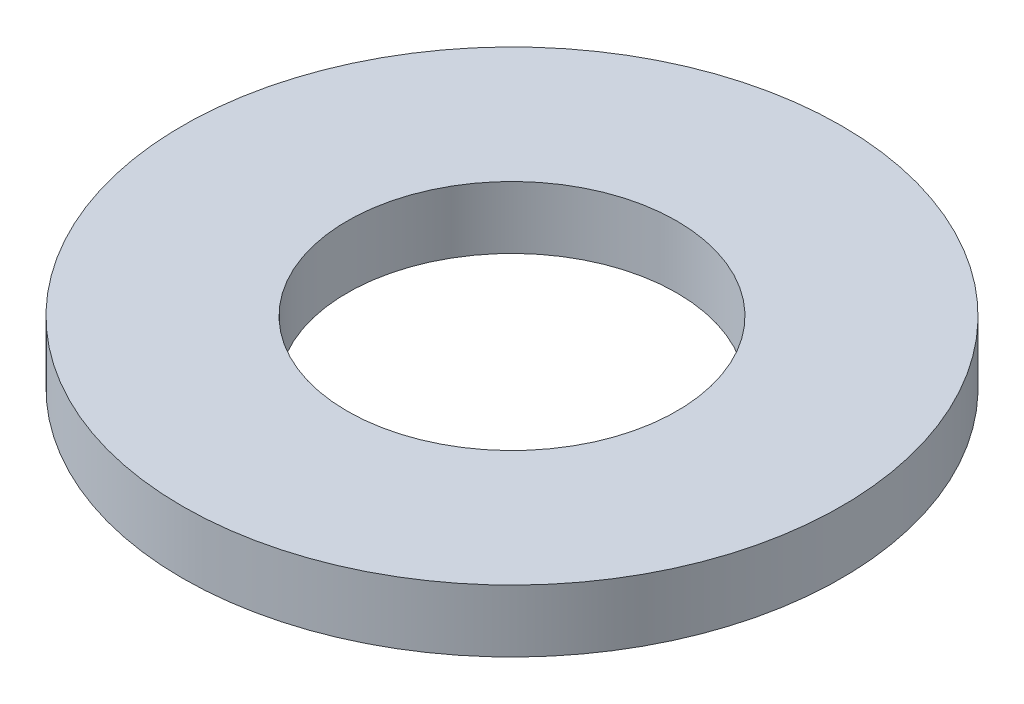
ISO-10303-21;
HEADER;
FILE_DESCRIPTION(('STEP AP214'),'2;1');
FILE_NAME('part.step','',(''),(''),'','','');
FILE_SCHEMA(('AUTOMOTIVE_DESIGN { 1 0 10303 214 1 1 1 1 }'));
ENDSEC;
DATA;
#1=APPLICATION_CONTEXT('core data for automotive mechanical design processes');
#2=APPLICATION_PROTOCOL_DEFINITION('international standard','automotive_design',2000,#1);
#3=PRODUCT_CONTEXT('',#1,'mechanical');
#4=PRODUCT('Part','Part','',(#3));
#5=PRODUCT_RELATED_PRODUCT_CATEGORY('part','',(#4));
#6=PRODUCT_DEFINITION_FORMATION('','',#4);
#7=PRODUCT_DEFINITION_CONTEXT('part definition',#1,'design');
#8=PRODUCT_DEFINITION('design','',#6,#7);
#9=PRODUCT_DEFINITION_SHAPE('','',#8);
#10=(LENGTH_UNIT() NAMED_UNIT(*) SI_UNIT(.MILLI.,.METRE.));
#11=(NAMED_UNIT(*) PLANE_ANGLE_UNIT() SI_UNIT($,.RADIAN.));
#12=(NAMED_UNIT(*) SI_UNIT($,.STERADIAN.) SOLID_ANGLE_UNIT());
#13=UNCERTAINTY_MEASURE_WITH_UNIT(LENGTH_MEASURE(1.E-05),#10,'distance_accuracy_value','');
#14=(GEOMETRIC_REPRESENTATION_CONTEXT(3) GLOBAL_UNCERTAINTY_ASSIGNED_CONTEXT((#13)) GLOBAL_UNIT_ASSIGNED_CONTEXT((#10,
#11,#12)) REPRESENTATION_CONTEXT('',''));
#15=CARTESIAN_POINT('',(0.,0.,0.));
#16=DIRECTION('',(0.,0.,1.));
#17=DIRECTION('',(1.,0.,0.));
#18=AXIS2_PLACEMENT_3D('',#15,#16,#17);
#19=CARTESIAN_POINT('',(-47.1142864227295,1.651,-64.5517635345459));
#20=DIRECTION('',(0.,-1.,0.));
#21=DIRECTION('',(0.,0.,-1.));
#22=AXIS2_PLACEMENT_3D('',#19,#20,#21);
#23=CYLINDRICAL_SURFACE('',#22,8.73125);
#24=CARTESIAN_POINT('',(-47.1142864227295,1.651,-64.5517635345459));
#25=DIRECTION('',(0.,-1.,0.));
#26=DIRECTION('',(0.,0.,1.));
#27=AXIS2_PLACEMENT_3D('',#24,#25,#26);
#28=CIRCLE('',#27,8.73125);
#29=CARTESIAN_POINT('',(-47.1142864227295,1.651,-73.2830135345459));
#30=VERTEX_POINT('',#29);
#31=EDGE_CURVE('E10',#30,#30,#28,.T.);
#32=CARTESIAN_POINT('',(-47.1142864227295,0.,-64.5517635345459));
#33=DIRECTION('',(0.,-1.,0.));
#34=DIRECTION('',(0.,0.,1.));
#35=AXIS2_PLACEMENT_3D('',#32,#33,#34);
#36=CIRCLE('',#35,8.73125);
#37=CARTESIAN_POINT('',(-47.1142864227295,0.,-73.2830135345459));
#38=VERTEX_POINT('',#37);
#39=EDGE_CURVE('E33',#38,#38,#36,.T.);
#40=CARTESIAN_POINT('',(-47.1142864227295,1.651,-73.2830135345459));
#41=CARTESIAN_POINT('',(-47.1142864227295,1.63380208333333,-73.2830135345459));
#42=CARTESIAN_POINT('',(-47.1142864227295,1.61660416666667,-73.2830135345459));
#43=CARTESIAN_POINT('',(-47.1142864227295,1.58220833333333,-73.2830135345459));
#44=CARTESIAN_POINT('',(-47.1142864227295,1.56501041666667,-73.2830135345459));
#45=CARTESIAN_POINT('',(-47.1142864227295,1.53061458333333,-73.2830135345459));
#46=CARTESIAN_POINT('',(-47.1142864227295,1.51341666666667,-73.2830135345459));
#47=CARTESIAN_POINT('',(-47.1142864227295,1.47902083333333,-73.2830135345459));
#48=CARTESIAN_POINT('',(-47.1142864227295,1.46182291666667,-73.2830135345459));
#49=CARTESIAN_POINT('',(-47.1142864227295,1.42742708333333,-73.2830135345459));
#50=CARTESIAN_POINT('',(-47.1142864227295,1.41022916666667,-73.2830135345459));
#51=CARTESIAN_POINT('',(-47.1142864227295,1.37583333333333,-73.2830135345459));
#52=CARTESIAN_POINT('',(-47.1142864227295,1.35863541666667,-73.2830135345459));
#53=CARTESIAN_POINT('',(-47.1142864227295,1.32423958333333,-73.2830135345459));
#54=CARTESIAN_POINT('',(-47.1142864227295,1.30704166666667,-73.2830135345459));
#55=CARTESIAN_POINT('',(-47.1142864227295,1.27264583333333,-73.2830135345459));
#56=CARTESIAN_POINT('',(-47.1142864227295,1.25544791666667,-73.2830135345459));
#57=CARTESIAN_POINT('',(-47.1142864227295,1.22105208333333,-73.2830135345459));
#58=CARTESIAN_POINT('',(-47.1142864227295,1.20385416666667,-73.2830135345459));
#59=CARTESIAN_POINT('',(-47.1142864227295,1.16945833333333,-73.2830135345459));
#60=CARTESIAN_POINT('',(-47.1142864227295,1.15226041666667,-73.2830135345459));
#61=CARTESIAN_POINT('',(-47.1142864227295,1.11786458333333,-73.2830135345459));
#62=CARTESIAN_POINT('',(-47.1142864227295,1.10066666666667,-73.2830135345459));
#63=CARTESIAN_POINT('',(-47.1142864227295,1.06627083333333,-73.2830135345459));
#64=CARTESIAN_POINT('',(-47.1142864227295,1.04907291666667,-73.2830135345459));
#65=CARTESIAN_POINT('',(-47.1142864227295,1.01467708333333,-73.2830135345459));
#66=CARTESIAN_POINT('',(-47.1142864227295,0.997479166666667,-73.2830135345459));
#67=CARTESIAN_POINT('',(-47.1142864227295,0.963083333333333,-73.2830135345459));
#68=CARTESIAN_POINT('',(-47.1142864227295,0.945885416666667,-73.2830135345459));
#69=CARTESIAN_POINT('',(-47.1142864227295,0.911489583333333,-73.2830135345459));
#70=CARTESIAN_POINT('',(-47.1142864227295,0.894291666666667,-73.2830135345459));
#71=CARTESIAN_POINT('',(-47.1142864227295,0.859895833333333,-73.2830135345459));
#72=CARTESIAN_POINT('',(-47.1142864227295,0.842697916666667,-73.2830135345459));
#73=CARTESIAN_POINT('',(-47.1142864227295,0.808302083333333,-73.2830135345459));
#74=CARTESIAN_POINT('',(-47.1142864227295,0.791104166666667,-73.2830135345459));
#75=CARTESIAN_POINT('',(-47.1142864227295,0.756708333333333,-73.2830135345459));
#76=CARTESIAN_POINT('',(-47.1142864227295,0.739510416666667,-73.2830135345459));
#77=CARTESIAN_POINT('',(-47.1142864227295,0.705114583333333,-73.2830135345459));
#78=CARTESIAN_POINT('',(-47.1142864227295,0.687916666666667,-73.2830135345459));
#79=CARTESIAN_POINT('',(-47.1142864227295,0.653520833333333,-73.2830135345459));
#80=CARTESIAN_POINT('',(-47.1142864227295,0.636322916666667,-73.2830135345459));
#81=CARTESIAN_POINT('',(-47.1142864227295,0.601927083333333,-73.2830135345459));
#82=CARTESIAN_POINT('',(-47.1142864227295,0.584729166666667,-73.2830135345459));
#83=CARTESIAN_POINT('',(-47.1142864227295,0.550333333333333,-73.2830135345459));
#84=CARTESIAN_POINT('',(-47.1142864227295,0.533135416666667,-73.2830135345459));
#85=CARTESIAN_POINT('',(-47.1142864227295,0.498739583333333,-73.2830135345459));
#86=CARTESIAN_POINT('',(-47.1142864227295,0.481541666666667,-73.2830135345459));
#87=CARTESIAN_POINT('',(-47.1142864227295,0.447145833333333,-73.2830135345459));
#88=CARTESIAN_POINT('',(-47.1142864227295,0.429947916666667,-73.2830135345459));
#89=CARTESIAN_POINT('',(-47.1142864227295,0.395552083333333,-73.2830135345459));
#90=CARTESIAN_POINT('',(-47.1142864227295,0.378354166666667,-73.2830135345459));
#91=CARTESIAN_POINT('',(-47.1142864227295,0.343958333333333,-73.2830135345459));
#92=CARTESIAN_POINT('',(-47.1142864227295,0.326760416666667,-73.2830135345459));
#93=CARTESIAN_POINT('',(-47.1142864227295,0.292364583333333,-73.2830135345459));
#94=CARTESIAN_POINT('',(-47.1142864227295,0.275166666666667,-73.2830135345459));
#95=CARTESIAN_POINT('',(-47.1142864227295,0.240770833333333,-73.2830135345459));
#96=CARTESIAN_POINT('',(-47.1142864227295,0.223572916666667,-73.2830135345459));
#97=CARTESIAN_POINT('',(-47.1142864227295,0.189177083333333,-73.2830135345459));
#98=CARTESIAN_POINT('',(-47.1142864227295,0.171979166666667,-73.2830135345459));
#99=CARTESIAN_POINT('',(-47.1142864227295,0.137583333333333,-73.2830135345459));
#100=CARTESIAN_POINT('',(-47.1142864227295,0.120385416666667,-73.2830135345459));
#101=CARTESIAN_POINT('',(-47.1142864227295,0.0859895833333333,-73.2830135345459));
#102=CARTESIAN_POINT('',(-47.1142864227295,0.0687916666666667,-73.2830135345459));
#103=CARTESIAN_POINT('',(-47.1142864227295,0.0343958333333333,-73.2830135345459));
#104=CARTESIAN_POINT('',(-47.1142864227295,0.0171979166666666,-73.2830135345459));
#105=CARTESIAN_POINT('',(-47.1142864227295,0.,-73.2830135345459));
#106=B_SPLINE_CURVE_WITH_KNOTS('',3,(#40,#41,#42,#43,#44,#45,#46,#47,#48,#49,#50,#51,#52,#53,
#54,#55,#56,#57,#58,#59,#60,#61,#62,#63,#64,#65,#66,#67,#68,#69,#70,#71,#72,#73,#74,#75,#76,#77,
#78,#79,#80,#81,#82,#83,#84,#85,#86,#87,#88,#89,#90,#91,#92,#93,#94,#95,#96,#97,#98,#99,#100,
#101,#102,#103,#104,#105),.UNSPECIFIED.,.F.,.F.,(4,2,2,2,2,2,2,2,2,2,2,2,2,2,2,2,2,2,2,2,2,2,2,
2,2,2,2,2,2,2,2,2,4),(0.,0.05159375,0.1031875,0.15478125,0.206375,0.25796875,0.3095625,
0.36115625,0.41275,0.46434375,0.5159375,0.56753125,0.619125,0.67071875,0.7223125,0.77390625,
0.8255,0.87709375,0.9286875,0.98028125,1.031875,1.08346875,1.1350625,1.18665625,1.23825,
1.28984375,1.3414375,1.39303125,1.444625,1.49621875,1.5478125,1.59940625,1.651),.UNSPECIFIED.);
#107=EDGE_CURVE('BSEAM30',#30,#38,#106,.T.);
#108=ORIENTED_EDGE('',*,*,#31,.T.);
#109=ORIENTED_EDGE('',*,*,#39,.F.);
#110=ORIENTED_EDGE('',*,*,#107,.T.);
#111=ORIENTED_EDGE('',*,*,#107,.F.);
#112=EDGE_LOOP('',(#108,#110,#109,#111));
#113=FACE_BOUND('',#112,.T.);
#114=ADVANCED_FACE('F30',(#113),#23,.T.);
#115=CARTESIAN_POINT('',(-47.1142864227295,1.651,-64.5517635345459));
#116=DIRECTION('',(0.,1.,0.));
#117=DIRECTION('',(0.,0.,1.));
#118=AXIS2_PLACEMENT_3D('',#115,#116,#117);
#119=PLANE('',#118);
#120=CARTESIAN_POINT('',(-47.1142864227295,1.651,-64.5517635345459));
#121=DIRECTION('',(0.,-1.,0.));
#122=DIRECTION('',(0.,0.,1.));
#123=AXIS2_PLACEMENT_3D('',#120,#121,#122);
#124=CIRCLE('',#123,4.365625);
#125=CARTESIAN_POINT('',(-47.1142864227295,1.651,-68.9173885345459));
#126=VERTEX_POINT('',#125);
#127=EDGE_CURVE('E40',#126,#126,#124,.T.);
#128=ORIENTED_EDGE('',*,*,#127,.T.);
#129=EDGE_LOOP('',(#128));
#130=FACE_BOUND('',#129,.T.);
#131=ORIENTED_EDGE('',*,*,#31,.F.);
#132=EDGE_LOOP('',(#131));
#133=FACE_BOUND('',#132,.T.);
#134=ADVANCED_FACE('F48',(#130,#133),#119,.T.);
#135=CARTESIAN_POINT('',(-47.1142864227295,0.,-64.5517635345459));
#136=DIRECTION('',(0.,1.,0.));
#137=DIRECTION('',(0.,0.,1.));
#138=AXIS2_PLACEMENT_3D('',#135,#136,#137);
#139=PLANE('',#138);
#140=CARTESIAN_POINT('',(-47.1142864227295,0.,-64.5517635345459));
#141=DIRECTION('',(0.,-1.,0.));
#142=DIRECTION('',(0.,0.,1.));
#143=AXIS2_PLACEMENT_3D('',#140,#141,#142);
#144=CIRCLE('',#143,4.365625);
#145=CARTESIAN_POINT('',(-47.1142864227295,0.,-68.9173885345459));
#146=VERTEX_POINT('',#145);
#147=EDGE_CURVE('E42',#146,#146,#144,.T.);
#148=ORIENTED_EDGE('',*,*,#147,.F.);
#149=EDGE_LOOP('',(#148));
#150=FACE_BOUND('',#149,.T.);
#151=ORIENTED_EDGE('',*,*,#39,.T.);
#152=EDGE_LOOP('',(#151));
#153=FACE_BOUND('',#152,.T.);
#154=ADVANCED_FACE('F54',(#150,#153),#139,.F.);
#155=CARTESIAN_POINT('',(-47.1142864227295,1.651,-64.5517635345459));
#156=DIRECTION('',(0.,-1.,0.));
#157=DIRECTION('',(0.,0.,-1.));
#158=AXIS2_PLACEMENT_3D('',#155,#156,#157);
#159=CYLINDRICAL_SURFACE('',#158,4.365625);
#160=CARTESIAN_POINT('',(-47.1142864227295,1.651,-68.9173885345459));
#161=CARTESIAN_POINT('',(-47.1142864227295,1.63380208333333,-68.9173885345459));
#162=CARTESIAN_POINT('',(-47.1142864227295,1.61660416666667,-68.9173885345459));
#163=CARTESIAN_POINT('',(-47.1142864227295,1.58220833333333,-68.9173885345459));
#164=CARTESIAN_POINT('',(-47.1142864227295,1.56501041666667,-68.9173885345459));
#165=CARTESIAN_POINT('',(-47.1142864227295,1.53061458333333,-68.9173885345459));
#166=CARTESIAN_POINT('',(-47.1142864227295,1.51341666666667,-68.9173885345459));
#167=CARTESIAN_POINT('',(-47.1142864227295,1.47902083333333,-68.9173885345459));
#168=CARTESIAN_POINT('',(-47.1142864227295,1.46182291666667,-68.9173885345459));
#169=CARTESIAN_POINT('',(-47.1142864227295,1.42742708333333,-68.9173885345459));
#170=CARTESIAN_POINT('',(-47.1142864227295,1.41022916666667,-68.9173885345459));
#171=CARTESIAN_POINT('',(-47.1142864227295,1.37583333333333,-68.9173885345459));
#172=CARTESIAN_POINT('',(-47.1142864227295,1.35863541666667,-68.9173885345459));
#173=CARTESIAN_POINT('',(-47.1142864227295,1.32423958333333,-68.9173885345459));
#174=CARTESIAN_POINT('',(-47.1142864227295,1.30704166666667,-68.9173885345459));
#175=CARTESIAN_POINT('',(-47.1142864227295,1.27264583333333,-68.9173885345459));
#176=CARTESIAN_POINT('',(-47.1142864227295,1.25544791666667,-68.9173885345459));
#177=CARTESIAN_POINT('',(-47.1142864227295,1.22105208333333,-68.9173885345459));
#178=CARTESIAN_POINT('',(-47.1142864227295,1.20385416666667,-68.9173885345459));
#179=CARTESIAN_POINT('',(-47.1142864227295,1.16945833333333,-68.9173885345459));
#180=CARTESIAN_POINT('',(-47.1142864227295,1.15226041666667,-68.9173885345459));
#181=CARTESIAN_POINT('',(-47.1142864227295,1.11786458333333,-68.9173885345459));
#182=CARTESIAN_POINT('',(-47.1142864227295,1.10066666666667,-68.9173885345459));
#183=CARTESIAN_POINT('',(-47.1142864227295,1.06627083333333,-68.9173885345459));
#184=CARTESIAN_POINT('',(-47.1142864227295,1.04907291666667,-68.9173885345459));
#185=CARTESIAN_POINT('',(-47.1142864227295,1.01467708333333,-68.9173885345459));
#186=CARTESIAN_POINT('',(-47.1142864227295,0.997479166666667,-68.9173885345459));
#187=CARTESIAN_POINT('',(-47.1142864227295,0.963083333333333,-68.9173885345459));
#188=CARTESIAN_POINT('',(-47.1142864227295,0.945885416666667,-68.9173885345459));
#189=CARTESIAN_POINT('',(-47.1142864227295,0.911489583333333,-68.9173885345459));
#190=CARTESIAN_POINT('',(-47.1142864227295,0.894291666666667,-68.9173885345459));
#191=CARTESIAN_POINT('',(-47.1142864227295,0.859895833333333,-68.9173885345459));
#192=CARTESIAN_POINT('',(-47.1142864227295,0.842697916666667,-68.9173885345459));
#193=CARTESIAN_POINT('',(-47.1142864227295,0.808302083333333,-68.9173885345459));
#194=CARTESIAN_POINT('',(-47.1142864227295,0.791104166666667,-68.9173885345459));
#195=CARTESIAN_POINT('',(-47.1142864227295,0.756708333333333,-68.9173885345459));
#196=CARTESIAN_POINT('',(-47.1142864227295,0.739510416666667,-68.9173885345459));
#197=CARTESIAN_POINT('',(-47.1142864227295,0.705114583333333,-68.9173885345459));
#198=CARTESIAN_POINT('',(-47.1142864227295,0.687916666666667,-68.9173885345459));
#199=CARTESIAN_POINT('',(-47.1142864227295,0.653520833333333,-68.9173885345459));
#200=CARTESIAN_POINT('',(-47.1142864227295,0.636322916666667,-68.9173885345459));
#201=CARTESIAN_POINT('',(-47.1142864227295,0.601927083333333,-68.9173885345459));
#202=CARTESIAN_POINT('',(-47.1142864227295,0.584729166666667,-68.9173885345459));
#203=CARTESIAN_POINT('',(-47.1142864227295,0.550333333333333,-68.9173885345459));
#204=CARTESIAN_POINT('',(-47.1142864227295,0.533135416666667,-68.9173885345459));
#205=CARTESIAN_POINT('',(-47.1142864227295,0.498739583333333,-68.9173885345459));
#206=CARTESIAN_POINT('',(-47.1142864227295,0.481541666666667,-68.9173885345459));
#207=CARTESIAN_POINT('',(-47.1142864227295,0.447145833333333,-68.9173885345459));
#208=CARTESIAN_POINT('',(-47.1142864227295,0.429947916666667,-68.9173885345459));
#209=CARTESIAN_POINT('',(-47.1142864227295,0.395552083333333,-68.9173885345459));
#210=CARTESIAN_POINT('',(-47.1142864227295,0.378354166666667,-68.9173885345459));
#211=CARTESIAN_POINT('',(-47.1142864227295,0.343958333333333,-68.9173885345459));
#212=CARTESIAN_POINT('',(-47.1142864227295,0.326760416666667,-68.9173885345459));
#213=CARTESIAN_POINT('',(-47.1142864227295,0.292364583333333,-68.9173885345459));
#214=CARTESIAN_POINT('',(-47.1142864227295,0.275166666666667,-68.9173885345459));
#215=CARTESIAN_POINT('',(-47.1142864227295,0.240770833333333,-68.9173885345459));
#216=CARTESIAN_POINT('',(-47.1142864227295,0.223572916666667,-68.9173885345459));
#217=CARTESIAN_POINT('',(-47.1142864227295,0.189177083333333,-68.9173885345459));
#218=CARTESIAN_POINT('',(-47.1142864227295,0.171979166666667,-68.9173885345459));
#219=CARTESIAN_POINT('',(-47.1142864227295,0.137583333333333,-68.9173885345459));
#220=CARTESIAN_POINT('',(-47.1142864227295,0.120385416666667,-68.9173885345459));
#221=CARTESIAN_POINT('',(-47.1142864227295,0.0859895833333333,-68.9173885345459));
#222=CARTESIAN_POINT('',(-47.1142864227295,0.0687916666666667,-68.9173885345459));
#223=CARTESIAN_POINT('',(-47.1142864227295,0.0343958333333333,-68.9173885345459));
#224=CARTESIAN_POINT('',(-47.1142864227295,0.0171979166666666,-68.9173885345459));
#225=CARTESIAN_POINT('',(-47.1142864227295,0.,-68.9173885345459));
#226=B_SPLINE_CURVE_WITH_KNOTS('',3,(#160,#161,#162,#163,#164,#165,#166,#167,#168,#169,#170,
#171,#172,#173,#174,#175,#176,#177,#178,#179,#180,#181,#182,#183,#184,#185,#186,#187,#188,#189,
#190,#191,#192,#193,#194,#195,#196,#197,#198,#199,#200,#201,#202,#203,#204,#205,#206,#207,#208,
#209,#210,#211,#212,#213,#214,#215,#216,#217,#218,#219,#220,#221,#222,#223,#224,#225),
.UNSPECIFIED.,.F.,.F.,(4,2,2,2,2,2,2,2,2,2,2,2,2,2,2,2,2,2,2,2,2,2,2,2,2,2,2,2,2,2,2,2,4),(0.,
0.05159375,0.1031875,0.15478125,0.206375,0.25796875,0.3095625,0.36115625,0.41275,0.46434375,
0.5159375,0.56753125,0.619125,0.67071875,0.7223125,0.77390625,0.8255,0.87709375,0.9286875,
0.98028125,1.031875,1.08346875,1.1350625,1.18665625,1.23825,1.28984375,1.3414375,1.39303125,
1.444625,1.49621875,1.5478125,1.59940625,1.651),.UNSPECIFIED.);
#227=EDGE_CURVE('BSEAM51',#126,#146,#226,.T.);
#228=ORIENTED_EDGE('',*,*,#127,.F.);
#229=ORIENTED_EDGE('',*,*,#147,.T.);
#230=ORIENTED_EDGE('',*,*,#227,.T.);
#231=ORIENTED_EDGE('',*,*,#227,.F.);
#232=EDGE_LOOP('',(#228,#230,#229,#231));
#233=FACE_BOUND('',#232,.T.);
#234=ADVANCED_FACE('F51',(#233),#159,.F.);
#235=CLOSED_SHELL('',(#114,#134,#154,#234));
#236=MANIFOLD_SOLID_BREP('B2',#235);
#237=ADVANCED_BREP_SHAPE_REPRESENTATION('',(#18,#236),#14);
#238=SHAPE_DEFINITION_REPRESENTATION(#9,#237);
ENDSEC;
END-ISO-10303-21;
